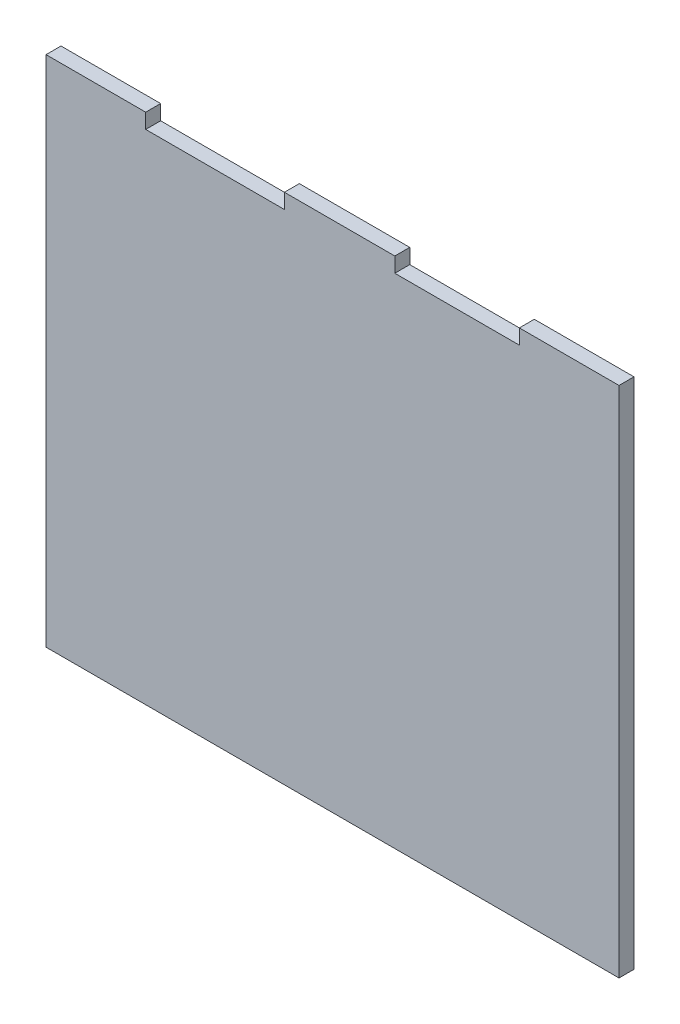
ISO-10303-21;
HEADER;
FILE_DESCRIPTION(('STEP AP214'),'2;1');
FILE_NAME('part.step','',(''),(''),'','','');
FILE_SCHEMA(('AUTOMOTIVE_DESIGN { 1 0 10303 214 1 1 1 1 }'));
ENDSEC;
DATA;
#1=APPLICATION_CONTEXT('core data for automotive mechanical design processes');
#2=APPLICATION_PROTOCOL_DEFINITION('international standard','automotive_design',2000,#1);
#3=PRODUCT_CONTEXT('',#1,'mechanical');
#4=PRODUCT('Part','Part','',(#3));
#5=PRODUCT_RELATED_PRODUCT_CATEGORY('part','',(#4));
#6=PRODUCT_DEFINITION_FORMATION('','',#4);
#7=PRODUCT_DEFINITION_CONTEXT('part definition',#1,'design');
#8=PRODUCT_DEFINITION('design','',#6,#7);
#9=PRODUCT_DEFINITION_SHAPE('','',#8);
#10=(LENGTH_UNIT() NAMED_UNIT(*) SI_UNIT(.MILLI.,.METRE.));
#11=(NAMED_UNIT(*) PLANE_ANGLE_UNIT() SI_UNIT($,.RADIAN.));
#12=(NAMED_UNIT(*) SI_UNIT($,.STERADIAN.) SOLID_ANGLE_UNIT());
#13=UNCERTAINTY_MEASURE_WITH_UNIT(LENGTH_MEASURE(1.E-05),#10,'distance_accuracy_value','');
#14=(GEOMETRIC_REPRESENTATION_CONTEXT(3) GLOBAL_UNCERTAINTY_ASSIGNED_CONTEXT((#13)) GLOBAL_UNIT_ASSIGNED_CONTEXT((#10,
#11,#12)) REPRESENTATION_CONTEXT('',''));
#15=CARTESIAN_POINT('',(0.,0.,0.));
#16=DIRECTION('',(0.,0.,1.));
#17=DIRECTION('',(1.,0.,0.));
#18=AXIS2_PLACEMENT_3D('',#15,#16,#17);
#19=CARTESIAN_POINT('',(0.,53.,3.));
#20=DIRECTION('',(0.,-1.,0.));
#21=DIRECTION('',(0.,0.,-1.));
#22=AXIS2_PLACEMENT_3D('',#19,#20,#21);
#23=PLANE('',#22);
#24=DIRECTION('',(-1.,0.,0.));
#25=VECTOR('',#24,1.);
#26=CARTESIAN_POINT('',(0.,53.,0.));
#27=LINE('',#26,#25);
#28=CARTESIAN_POINT('',(58.5,53.,0.));
#29=VERTEX_POINT('',#28);
#30=CARTESIAN_POINT('',(38.5,53.,0.));
#31=VERTEX_POINT('',#30);
#32=EDGE_CURVE('E190',#29,#31,#27,.T.);
#33=ORIENTED_EDGE('',*,*,#32,.T.);
#34=DIRECTION('',(0.,0.,-1.));
#35=VECTOR('',#34,1.);
#36=CARTESIAN_POINT('',(38.5,53.,3.));
#37=LINE('',#36,#35);
#38=CARTESIAN_POINT('',(38.5,53.,3.));
#39=VERTEX_POINT('',#38);
#40=EDGE_CURVE('E149',#39,#31,#37,.T.);
#41=ORIENTED_EDGE('',*,*,#40,.F.);
#42=DIRECTION('',(-1.,0.,0.));
#43=VECTOR('',#42,1.);
#44=CARTESIAN_POINT('',(0.,53.,3.));
#45=LINE('',#44,#43);
#46=CARTESIAN_POINT('',(58.5,53.,3.));
#47=VERTEX_POINT('',#46);
#48=EDGE_CURVE('E214',#47,#39,#45,.T.);
#49=ORIENTED_EDGE('',*,*,#48,.F.);
#50=DIRECTION('',(0.,0.,-1.));
#51=VECTOR('',#50,1.);
#52=CARTESIAN_POINT('',(58.5,53.,3.));
#53=LINE('',#52,#51);
#54=EDGE_CURVE('E87',#47,#29,#53,.T.);
#55=ORIENTED_EDGE('',*,*,#54,.T.);
#56=EDGE_LOOP('',(#33,#41,#49,#55));
#57=FACE_BOUND('',#56,.T.);
#58=ADVANCED_FACE('F77',(#57),#23,.F.);
#59=CARTESIAN_POINT('',(38.5,0.,3.));
#60=DIRECTION('',(-1.,0.,0.));
#61=DIRECTION('',(0.,0.,1.));
#62=AXIS2_PLACEMENT_3D('',#59,#60,#61);
#63=PLANE('',#62);
#64=DIRECTION('',(0.,1.,0.));
#65=VECTOR('',#64,1.);
#66=CARTESIAN_POINT('',(38.5,0.,0.));
#67=LINE('',#66,#65);
#68=CARTESIAN_POINT('',(38.5,50.,0.));
#69=VERTEX_POINT('',#68);
#70=EDGE_CURVE('E187',#69,#31,#67,.T.);
#71=ORIENTED_EDGE('',*,*,#70,.F.);
#72=DIRECTION('',(0.,0.,-1.));
#73=VECTOR('',#72,1.);
#74=CARTESIAN_POINT('',(38.5,50.,3.));
#75=LINE('',#74,#73);
#76=CARTESIAN_POINT('',(38.5,50.,3.));
#77=VERTEX_POINT('',#76);
#78=EDGE_CURVE('E152',#77,#69,#75,.T.);
#79=ORIENTED_EDGE('',*,*,#78,.F.);
#80=DIRECTION('',(0.,1.,0.));
#81=VECTOR('',#80,1.);
#82=CARTESIAN_POINT('',(38.5,0.,3.));
#83=LINE('',#82,#81);
#84=EDGE_CURVE('E211',#77,#39,#83,.T.);
#85=ORIENTED_EDGE('',*,*,#84,.T.);
#86=ORIENTED_EDGE('',*,*,#40,.T.);
#87=EDGE_LOOP('',(#71,#79,#85,#86));
#88=FACE_BOUND('',#87,.T.);
#89=ADVANCED_FACE('F287',(#88),#63,.T.);
#90=CARTESIAN_POINT('',(0.,50.,3.));
#91=DIRECTION('',(0.,1.,0.));
#92=DIRECTION('',(0.,0.,1.));
#93=AXIS2_PLACEMENT_3D('',#90,#91,#92);
#94=PLANE('',#93);
#95=DIRECTION('',(1.,0.,0.));
#96=VECTOR('',#95,1.);
#97=CARTESIAN_POINT('',(0.,50.,0.));
#98=LINE('',#97,#96);
#99=CARTESIAN_POINT('',(13.5,50.,0.));
#100=VERTEX_POINT('',#99);
#101=EDGE_CURVE('E184',#100,#69,#98,.T.);
#102=ORIENTED_EDGE('',*,*,#101,.F.);
#103=DIRECTION('',(0.,0.,-1.));
#104=VECTOR('',#103,1.);
#105=CARTESIAN_POINT('',(13.5,50.,3.));
#106=LINE('',#105,#104);
#107=CARTESIAN_POINT('',(13.5,50.,3.));
#108=VERTEX_POINT('',#107);
#109=EDGE_CURVE('E155',#108,#100,#106,.T.);
#110=ORIENTED_EDGE('',*,*,#109,.F.);
#111=DIRECTION('',(1.,0.,0.));
#112=VECTOR('',#111,1.);
#113=CARTESIAN_POINT('',(0.,50.,3.));
#114=LINE('',#113,#112);
#115=EDGE_CURVE('E208',#108,#77,#114,.T.);
#116=ORIENTED_EDGE('',*,*,#115,.T.);
#117=ORIENTED_EDGE('',*,*,#78,.T.);
#118=EDGE_LOOP('',(#102,#110,#116,#117));
#119=FACE_BOUND('',#118,.T.);
#120=ADVANCED_FACE('F282',(#119),#94,.T.);
#121=CARTESIAN_POINT('',(13.5,0.,3.));
#122=DIRECTION('',(-1.,0.,0.));
#123=DIRECTION('',(0.,0.,1.));
#124=AXIS2_PLACEMENT_3D('',#121,#122,#123);
#125=PLANE('',#124);
#126=DIRECTION('',(0.,1.,0.));
#127=VECTOR('',#126,1.);
#128=CARTESIAN_POINT('',(13.5,0.,0.));
#129=LINE('',#128,#127);
#130=CARTESIAN_POINT('',(13.5,53.,0.));
#131=VERTEX_POINT('',#130);
#132=EDGE_CURVE('E181',#100,#131,#129,.T.);
#133=ORIENTED_EDGE('',*,*,#132,.T.);
#134=DIRECTION('',(0.,0.,-1.));
#135=VECTOR('',#134,1.);
#136=CARTESIAN_POINT('',(13.5,53.,3.));
#137=LINE('',#136,#135);
#138=CARTESIAN_POINT('',(13.5,53.,3.));
#139=VERTEX_POINT('',#138);
#140=EDGE_CURVE('E158',#139,#131,#137,.T.);
#141=ORIENTED_EDGE('',*,*,#140,.F.);
#142=DIRECTION('',(0.,1.,0.));
#143=VECTOR('',#142,1.);
#144=CARTESIAN_POINT('',(13.5,0.,3.));
#145=LINE('',#144,#143);
#146=EDGE_CURVE('E205',#108,#139,#145,.T.);
#147=ORIENTED_EDGE('',*,*,#146,.F.);
#148=ORIENTED_EDGE('',*,*,#109,.T.);
#149=EDGE_LOOP('',(#133,#141,#147,#148));
#150=FACE_BOUND('',#149,.T.);
#151=ADVANCED_FACE('F290',(#150),#125,.F.);
#152=CARTESIAN_POINT('',(0.,53.,3.));
#153=DIRECTION('',(0.,1.,0.));
#154=DIRECTION('',(0.,0.,1.));
#155=AXIS2_PLACEMENT_3D('',#152,#153,#154);
#156=PLANE('',#155);
#157=DIRECTION('',(1.,0.,0.));
#158=VECTOR('',#157,1.);
#159=CARTESIAN_POINT('',(0.,53.,0.));
#160=LINE('',#159,#158);
#161=CARTESIAN_POINT('',(-8.66000000000001,53.,0.));
#162=VERTEX_POINT('',#161);
#163=EDGE_CURVE('E178',#162,#131,#160,.T.);
#164=ORIENTED_EDGE('',*,*,#163,.F.);
#165=DIRECTION('',(0.,0.,-1.));
#166=VECTOR('',#165,1.);
#167=CARTESIAN_POINT('',(-8.66000000000001,53.,3.));
#168=LINE('',#167,#166);
#169=CARTESIAN_POINT('',(-8.66000000000001,53.,3.));
#170=VERTEX_POINT('',#169);
#171=EDGE_CURVE('E161',#170,#162,#168,.T.);
#172=ORIENTED_EDGE('',*,*,#171,.F.);
#173=DIRECTION('',(1.,0.,0.));
#174=VECTOR('',#173,1.);
#175=CARTESIAN_POINT('',(0.,53.,3.));
#176=LINE('',#175,#174);
#177=EDGE_CURVE('E202',#170,#139,#176,.T.);
#178=ORIENTED_EDGE('',*,*,#177,.T.);
#179=ORIENTED_EDGE('',*,*,#140,.T.);
#180=EDGE_LOOP('',(#164,#172,#178,#179));
#181=FACE_BOUND('',#180,.T.);
#182=ADVANCED_FACE('F276',(#181),#156,.T.);
#183=CARTESIAN_POINT('',(-8.66000000000001,0.,3.));
#184=DIRECTION('',(-1.,0.,0.));
#185=DIRECTION('',(0.,0.,1.));
#186=AXIS2_PLACEMENT_3D('',#183,#184,#185);
#187=PLANE('',#186);
#188=DIRECTION('',(0.,1.,0.));
#189=VECTOR('',#188,1.);
#190=CARTESIAN_POINT('',(-8.66000000000001,0.,0.));
#191=LINE('',#190,#189);
#192=CARTESIAN_POINT('',(-8.66000000000001,50.,0.));
#193=VERTEX_POINT('',#192);
#194=EDGE_CURVE('E175',#193,#162,#191,.T.);
#195=ORIENTED_EDGE('',*,*,#194,.F.);
#196=DIRECTION('',(0.,0.,-1.));
#197=VECTOR('',#196,1.);
#198=CARTESIAN_POINT('',(-8.66000000000001,50.,3.));
#199=LINE('',#198,#197);
#200=CARTESIAN_POINT('',(-8.66000000000001,50.,3.));
#201=VERTEX_POINT('',#200);
#202=EDGE_CURVE('E164',#201,#193,#199,.T.);
#203=ORIENTED_EDGE('',*,*,#202,.F.);
#204=DIRECTION('',(0.,1.,0.));
#205=VECTOR('',#204,1.);
#206=CARTESIAN_POINT('',(-8.66000000000001,0.,3.));
#207=LINE('',#206,#205);
#208=EDGE_CURVE('E199',#201,#170,#207,.T.);
#209=ORIENTED_EDGE('',*,*,#208,.T.);
#210=ORIENTED_EDGE('',*,*,#171,.T.);
#211=EDGE_LOOP('',(#195,#203,#209,#210));
#212=FACE_BOUND('',#211,.T.);
#213=ADVANCED_FACE('F272',(#212),#187,.T.);
#214=CARTESIAN_POINT('',(-36.5,50.,0.));
#215=VERTEX_POINT('',#214);
#216=EDGE_CURVE('E130',#215,#193,#98,.T.);
#217=ORIENTED_EDGE('',*,*,#216,.F.);
#218=DIRECTION('',(0.,0.,1.));
#219=VECTOR('',#218,1.);
#220=CARTESIAN_POINT('',(-36.5,50.,3.));
#221=LINE('',#220,#219);
#222=CARTESIAN_POINT('',(-36.5,50.,3.));
#223=VERTEX_POINT('',#222);
#224=EDGE_CURVE('E12',#215,#223,#221,.T.);
#225=ORIENTED_EDGE('',*,*,#224,.T.);
#226=EDGE_CURVE('E198',#223,#201,#114,.T.);
#227=ORIENTED_EDGE('',*,*,#226,.T.);
#228=ORIENTED_EDGE('',*,*,#202,.T.);
#229=EDGE_LOOP('',(#217,#225,#227,#228));
#230=FACE_BOUND('',#229,.T.);
#231=ADVANCED_FACE('F268',(#230),#94,.T.);
#232=CARTESIAN_POINT('',(-56.5,0.,3.));
#233=DIRECTION('',(1.,0.,0.));
#234=DIRECTION('',(0.,1.,0.));
#235=AXIS2_PLACEMENT_3D('',#232,#233,#234);
#236=PLANE('',#235);
#237=DIRECTION('',(0.,-1.,0.));
#238=VECTOR('',#237,1.);
#239=CARTESIAN_POINT('',(-56.5,0.,0.));
#240=LINE('',#239,#238);
#241=CARTESIAN_POINT('',(-56.5,53.,0.));
#242=VERTEX_POINT('',#241);
#243=CARTESIAN_POINT('',(-56.5,-50.,0.));
#244=VERTEX_POINT('',#243);
#245=EDGE_CURVE('E118',#242,#244,#240,.T.);
#246=ORIENTED_EDGE('',*,*,#245,.T.);
#247=DIRECTION('',(0.,0.,-1.));
#248=VECTOR('',#247,1.);
#249=CARTESIAN_POINT('',(-56.5,-50.,3.));
#250=LINE('',#249,#248);
#251=CARTESIAN_POINT('',(-56.5,-50.,3.));
#252=VERTEX_POINT('',#251);
#253=EDGE_CURVE('E167',#252,#244,#250,.T.);
#254=ORIENTED_EDGE('',*,*,#253,.F.);
#255=DIRECTION('',(0.,-1.,0.));
#256=VECTOR('',#255,1.);
#257=CARTESIAN_POINT('',(-56.5,0.,3.));
#258=LINE('',#257,#256);
#259=CARTESIAN_POINT('',(-56.5,53.,3.));
#260=VERTEX_POINT('',#259);
#261=EDGE_CURVE('E136',#260,#252,#258,.T.);
#262=ORIENTED_EDGE('',*,*,#261,.F.);
#263=DIRECTION('',(0.,0.,-1.));
#264=VECTOR('',#263,1.);
#265=CARTESIAN_POINT('',(-56.5,53.,3.));
#266=LINE('',#265,#264);
#267=EDGE_CURVE('E133',#260,#242,#266,.T.);
#268=ORIENTED_EDGE('',*,*,#267,.T.);
#269=EDGE_LOOP('',(#246,#254,#262,#268));
#270=FACE_BOUND('',#269,.T.);
#271=ADVANCED_FACE('F134',(#270),#236,.F.);
#272=CARTESIAN_POINT('',(0.,-50.,3.));
#273=DIRECTION('',(0.,1.,0.));
#274=DIRECTION('',(0.,0.,1.));
#275=AXIS2_PLACEMENT_3D('',#272,#273,#274);
#276=PLANE('',#275);
#277=DIRECTION('',(1.,0.,0.));
#278=VECTOR('',#277,1.);
#279=CARTESIAN_POINT('',(0.,-50.,0.));
#280=LINE('',#279,#278);
#281=CARTESIAN_POINT('',(58.5,-50.,0.));
#282=VERTEX_POINT('',#281);
#283=EDGE_CURVE('E126',#244,#282,#280,.T.);
#284=ORIENTED_EDGE('',*,*,#283,.T.);
#285=DIRECTION('',(0.,0.,-1.));
#286=VECTOR('',#285,1.);
#287=CARTESIAN_POINT('',(58.5,-50.,3.));
#288=LINE('',#287,#286);
#289=CARTESIAN_POINT('',(58.5,-50.,3.));
#290=VERTEX_POINT('',#289);
#291=EDGE_CURVE('E169',#290,#282,#288,.T.);
#292=ORIENTED_EDGE('',*,*,#291,.F.);
#293=DIRECTION('',(1.,0.,0.));
#294=VECTOR('',#293,1.);
#295=CARTESIAN_POINT('',(0.,-50.,3.));
#296=LINE('',#295,#294);
#297=EDGE_CURVE('E172',#252,#290,#296,.T.);
#298=ORIENTED_EDGE('',*,*,#297,.F.);
#299=ORIENTED_EDGE('',*,*,#253,.T.);
#300=EDGE_LOOP('',(#284,#292,#298,#299));
#301=FACE_BOUND('',#300,.T.);
#302=ADVANCED_FACE('F307',(#301),#276,.F.);
#303=CARTESIAN_POINT('',(58.5,0.,3.));
#304=DIRECTION('',(1.,0.,0.));
#305=DIRECTION('',(0.,1.,0.));
#306=AXIS2_PLACEMENT_3D('',#303,#304,#305);
#307=PLANE('',#306);
#308=DIRECTION('',(0.,-1.,0.));
#309=VECTOR('',#308,1.);
#310=CARTESIAN_POINT('',(58.5,0.,0.));
#311=LINE('',#310,#309);
#312=EDGE_CURVE('E193',#29,#282,#311,.T.);
#313=ORIENTED_EDGE('',*,*,#312,.F.);
#314=ORIENTED_EDGE('',*,*,#54,.F.);
#315=DIRECTION('',(0.,-1.,0.));
#316=VECTOR('',#315,1.);
#317=CARTESIAN_POINT('',(58.5,0.,3.));
#318=LINE('',#317,#316);
#319=EDGE_CURVE('E173',#47,#290,#318,.T.);
#320=ORIENTED_EDGE('',*,*,#319,.T.);
#321=ORIENTED_EDGE('',*,*,#291,.T.);
#322=EDGE_LOOP('',(#313,#314,#320,#321));
#323=FACE_BOUND('',#322,.T.);
#324=ADVANCED_FACE('F222',(#323),#307,.T.);
#325=CARTESIAN_POINT('',(0.,0.,0.));
#326=DIRECTION('',(0.,0.,1.));
#327=DIRECTION('',(1.,0.,0.));
#328=AXIS2_PLACEMENT_3D('',#325,#326,#327);
#329=PLANE('',#328);
#330=ORIENTED_EDGE('',*,*,#312,.T.);
#331=ORIENTED_EDGE('',*,*,#283,.F.);
#332=ORIENTED_EDGE('',*,*,#245,.F.);
#333=DIRECTION('',(1.,0.,0.));
#334=VECTOR('',#333,1.);
#335=CARTESIAN_POINT('',(-56.5,53.,0.));
#336=LINE('',#335,#334);
#337=CARTESIAN_POINT('',(-36.5,53.,0.));
#338=VERTEX_POINT('',#337);
#339=EDGE_CURVE('E123',#242,#338,#336,.T.);
#340=ORIENTED_EDGE('',*,*,#339,.T.);
#341=DIRECTION('',(0.,1.,0.));
#342=VECTOR('',#341,1.);
#343=CARTESIAN_POINT('',(-36.5,50.,0.));
#344=LINE('',#343,#342);
#345=EDGE_CURVE('E141',#215,#338,#344,.T.);
#346=ORIENTED_EDGE('',*,*,#345,.F.);
#347=ORIENTED_EDGE('',*,*,#216,.T.);
#348=ORIENTED_EDGE('',*,*,#194,.T.);
#349=ORIENTED_EDGE('',*,*,#163,.T.);
#350=ORIENTED_EDGE('',*,*,#132,.F.);
#351=ORIENTED_EDGE('',*,*,#101,.T.);
#352=ORIENTED_EDGE('',*,*,#70,.T.);
#353=ORIENTED_EDGE('',*,*,#32,.F.);
#354=EDGE_LOOP('',(#330,#331,#332,#340,#346,#347,#348,#349,#350,#351,#352,#353));
#355=FACE_BOUND('',#354,.T.);
#356=ADVANCED_FACE('F121',(#355),#329,.F.);
#357=CARTESIAN_POINT('',(0.,0.,3.));
#358=DIRECTION('',(0.,0.,1.));
#359=DIRECTION('',(1.,0.,0.));
#360=AXIS2_PLACEMENT_3D('',#357,#358,#359);
#361=PLANE('',#360);
#362=ORIENTED_EDGE('',*,*,#319,.F.);
#363=ORIENTED_EDGE('',*,*,#48,.T.);
#364=ORIENTED_EDGE('',*,*,#84,.F.);
#365=ORIENTED_EDGE('',*,*,#115,.F.);
#366=ORIENTED_EDGE('',*,*,#146,.T.);
#367=ORIENTED_EDGE('',*,*,#177,.F.);
#368=ORIENTED_EDGE('',*,*,#208,.F.);
#369=ORIENTED_EDGE('',*,*,#226,.F.);
#370=DIRECTION('',(0.,1.,0.));
#371=VECTOR('',#370,1.);
#372=CARTESIAN_POINT('',(-36.5,50.,3.));
#373=LINE('',#372,#371);
#374=CARTESIAN_POINT('',(-36.5,53.,3.));
#375=VERTEX_POINT('',#374);
#376=EDGE_CURVE('E140',#223,#375,#373,.T.);
#377=ORIENTED_EDGE('',*,*,#376,.T.);
#378=DIRECTION('',(1.,0.,0.));
#379=VECTOR('',#378,1.);
#380=CARTESIAN_POINT('',(-56.5,53.,3.));
#381=LINE('',#380,#379);
#382=EDGE_CURVE('E138',#260,#375,#381,.T.);
#383=ORIENTED_EDGE('',*,*,#382,.F.);
#384=ORIENTED_EDGE('',*,*,#261,.T.);
#385=ORIENTED_EDGE('',*,*,#297,.T.);
#386=EDGE_LOOP('',(#362,#363,#364,#365,#366,#367,#368,#369,#377,#383,#384,#385));
#387=FACE_BOUND('',#386,.T.);
#388=ADVANCED_FACE('F230',(#387),#361,.T.);
#389=CARTESIAN_POINT('',(-36.5,50.,3.));
#390=DIRECTION('',(-1.,0.,0.));
#391=DIRECTION('',(0.,0.,1.));
#392=AXIS2_PLACEMENT_3D('',#389,#390,#391);
#393=PLANE('',#392);
#394=ORIENTED_EDGE('',*,*,#345,.T.);
#395=DIRECTION('',(0.,0.,-1.));
#396=VECTOR('',#395,1.);
#397=CARTESIAN_POINT('',(-36.5,53.,3.));
#398=LINE('',#397,#396);
#399=EDGE_CURVE('E81',#375,#338,#398,.T.);
#400=ORIENTED_EDGE('',*,*,#399,.F.);
#401=ORIENTED_EDGE('',*,*,#376,.F.);
#402=ORIENTED_EDGE('',*,*,#224,.F.);
#403=EDGE_LOOP('',(#394,#400,#401,#402));
#404=FACE_BOUND('',#403,.T.);
#405=ADVANCED_FACE('F79',(#404),#393,.F.);
#406=CARTESIAN_POINT('',(-56.5,53.,3.));
#407=DIRECTION('',(0.,1.,0.));
#408=DIRECTION('',(0.,0.,1.));
#409=AXIS2_PLACEMENT_3D('',#406,#407,#408);
#410=PLANE('',#409);
#411=ORIENTED_EDGE('',*,*,#339,.F.);
#412=ORIENTED_EDGE('',*,*,#267,.F.);
#413=ORIENTED_EDGE('',*,*,#382,.T.);
#414=ORIENTED_EDGE('',*,*,#399,.T.);
#415=EDGE_LOOP('',(#411,#412,#413,#414));
#416=FACE_BOUND('',#415,.T.);
#417=ADVANCED_FACE('F139',(#416),#410,.T.);
#418=CLOSED_SHELL('',(#58,#89,#120,#151,#182,#213,#231,#271,#302,#324,#356,#388,#405,#417));
#419=MANIFOLD_SOLID_BREP('B2',#418);
#420=ADVANCED_BREP_SHAPE_REPRESENTATION('',(#18,#419),#14);
#421=SHAPE_DEFINITION_REPRESENTATION(#9,#420);
ENDSEC;
END-ISO-10303-21;
